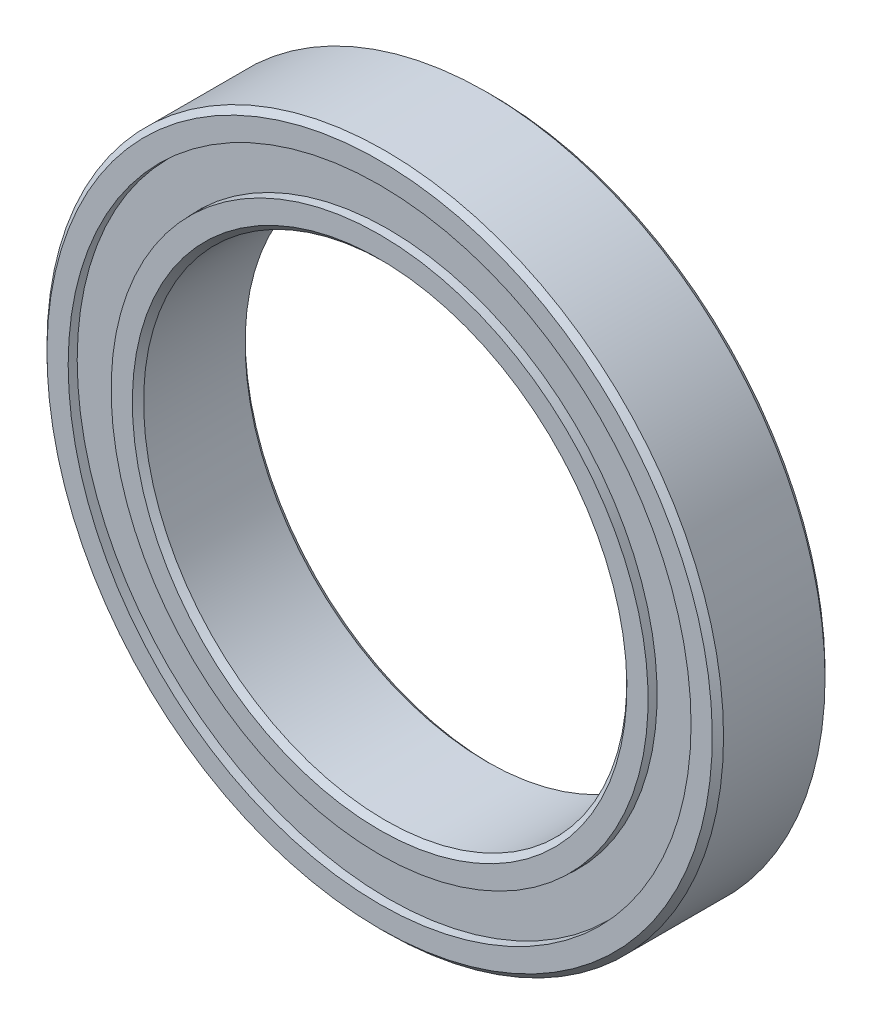
ISO-10303-21;
HEADER;
FILE_DESCRIPTION(('STEP AP214'),'2;1');
FILE_NAME('part.step','',(''),(''),'','','');
FILE_SCHEMA(('AUTOMOTIVE_DESIGN { 1 0 10303 214 1 1 1 1 }'));
ENDSEC;
DATA;
#1=APPLICATION_CONTEXT('core data for automotive mechanical design processes');
#2=APPLICATION_PROTOCOL_DEFINITION('international standard','automotive_design',2000,#1);
#3=PRODUCT_CONTEXT('',#1,'mechanical');
#4=PRODUCT('Part','Part','',(#3));
#5=PRODUCT_RELATED_PRODUCT_CATEGORY('part','',(#4));
#6=PRODUCT_DEFINITION_FORMATION('','',#4);
#7=PRODUCT_DEFINITION_CONTEXT('part definition',#1,'design');
#8=PRODUCT_DEFINITION('design','',#6,#7);
#9=PRODUCT_DEFINITION_SHAPE('','',#8);
#10=(LENGTH_UNIT() NAMED_UNIT(*) SI_UNIT(.MILLI.,.METRE.));
#11=(NAMED_UNIT(*) PLANE_ANGLE_UNIT() SI_UNIT($,.RADIAN.));
#12=(NAMED_UNIT(*) SI_UNIT($,.STERADIAN.) SOLID_ANGLE_UNIT());
#13=UNCERTAINTY_MEASURE_WITH_UNIT(LENGTH_MEASURE(1.E-05),#10,'distance_accuracy_value','');
#14=(GEOMETRIC_REPRESENTATION_CONTEXT(3) GLOBAL_UNCERTAINTY_ASSIGNED_CONTEXT((#13)) GLOBAL_UNIT_ASSIGNED_CONTEXT((#10,
#11,#12)) REPRESENTATION_CONTEXT('',''));
#15=CARTESIAN_POINT('',(0.,0.,0.));
#16=DIRECTION('',(0.,0.,1.));
#17=DIRECTION('',(1.,0.,0.));
#18=AXIS2_PLACEMENT_3D('',#15,#16,#17);
#19=CARTESIAN_POINT('',(6.50234999136853,16.7845001292785,0.));
#20=DIRECTION('',(0.,0.,1.));
#21=DIRECTION('',(0.361241666187141,0.932472229404361,0.));
#22=AXIS2_PLACEMENT_3D('',#19,#20,#21);
#23=SPHERICAL_SURFACE('',#22,2.0487876571762);
#24=CARTESIAN_POINT('',(6.50234999136853,16.7845001292785,2.04878765717619));
#25=VERTEX_POINT('',#24);
#26=VERTEX_LOOP('',#25);
#27=FACE_BOUND('',#26,.T.);
#28=ADVANCED_FACE('F46',(#27),#23,.T.);
#29=CLOSED_SHELL('',(#28));
#30=MANIFOLD_SOLID_BREP('B2',#29);
#31=CARTESIAN_POINT('',(12.1265215856379,13.302160509972,0.));
#32=DIRECTION('',(0.,0.,1.));
#33=DIRECTION('',(0.673695643646548,0.739008917220668,0.));
#34=AXIS2_PLACEMENT_3D('',#31,#32,#33);
#35=SPHERICAL_SURFACE('',#34,2.0487876571762);
#36=CARTESIAN_POINT('',(12.1265215856379,13.302160509972,2.04878765717619));
#37=VERTEX_POINT('',#36);
#38=VERTEX_LOOP('',#37);
#39=FACE_BOUND('',#38,.T.);
#40=ADVANCED_FACE('F69',(#39),#35,.T.);
#41=CLOSED_SHELL('',(#40));
#42=MANIFOLD_SOLID_BREP('B6',#41);
#43=CARTESIAN_POINT('',(16.112939244391,8.02329040397788,0.));
#44=DIRECTION('',(0.,0.,1.));
#45=DIRECTION('',(0.895163291355057,0.445738355776549,0.));
#46=AXIS2_PLACEMENT_3D('',#43,#44,#45);
#47=SPHERICAL_SURFACE('',#46,2.0487876571762);
#48=CARTESIAN_POINT('',(16.112939244391,8.02329040397788,2.04878765717619));
#49=VERTEX_POINT('',#48);
#50=VERTEX_LOOP('',#49);
#51=FACE_BOUND('',#50,.T.);
#52=ADVANCED_FACE('F92',(#51),#47,.T.);
#53=CLOSED_SHELL('',(#52));
#54=MANIFOLD_SOLID_BREP('B42',#53);
#55=CARTESIAN_POINT('',(17.9232151733106,1.66083047033963,0.));
#56=DIRECTION('',(0.,0.,1.));
#57=DIRECTION('',(0.995734176295033,0.092268359463313,0.));
#58=AXIS2_PLACEMENT_3D('',#55,#56,#57);
#59=SPHERICAL_SURFACE('',#58,2.0487876571762);
#60=CARTESIAN_POINT('',(17.9232151733106,1.66083047033963,2.04878765717619));
#61=VERTEX_POINT('',#60);
#62=VERTEX_LOOP('',#61);
#63=FACE_BOUND('',#62,.T.);
#64=ADVANCED_FACE('F115',(#63),#59,.T.);
#65=CLOSED_SHELL('',(#64));
#66=MANIFOLD_SOLID_BREP('B65',#65);
#67=CARTESIAN_POINT('',(17.3128615771108,-4.92593382129731,0.));
#68=DIRECTION('',(0.,0.,1.));
#69=DIRECTION('',(0.961825643172822,-0.273662990072073,0.));
#70=AXIS2_PLACEMENT_3D('',#67,#68,#69);
#71=SPHERICAL_SURFACE('',#70,2.0487876571762);
#72=CARTESIAN_POINT('',(17.3128615771108,-4.92593382129731,2.04878765717619));
#73=VERTEX_POINT('',#72);
#74=VERTEX_LOOP('',#73);
#75=FACE_BOUND('',#74,.T.);
#76=ADVANCED_FACE('F138',(#75),#71,.T.);
#77=CLOSED_SHELL('',(#76));
#78=MANIFOLD_SOLID_BREP('B88',#77);
#79=CARTESIAN_POINT('',(14.3643100910444,-10.8474234548265,0.));
#80=DIRECTION('',(0.,0.,1.));
#81=DIRECTION('',(0.798017227280245,-0.602634636379249,0.));
#82=AXIS2_PLACEMENT_3D('',#79,#80,#81);
#83=SPHERICAL_SURFACE('',#82,2.0487876571762);
#84=CARTESIAN_POINT('',(14.3643100910444,-10.8474234548265,2.04878765717619));
#85=VERTEX_POINT('',#84);
#86=VERTEX_LOOP('',#85);
#87=FACE_BOUND('',#86,.T.);
#88=ADVANCED_FACE('F161',(#87),#83,.T.);
#89=CLOSED_SHELL('',(#88));
#90=MANIFOLD_SOLID_BREP('B111',#89);
#91=CARTESIAN_POINT('',(9.47577893179253,-15.303908443133,0.));
#92=DIRECTION('',(0.,0.,1.));
#93=DIRECTION('',(0.526432162877363,-0.85021713572961,0.));
#94=AXIS2_PLACEMENT_3D('',#91,#92,#93);
#95=SPHERICAL_SURFACE('',#94,2.0487876571762);
#96=CARTESIAN_POINT('',(9.47577893179253,-15.303908443133,2.04878765717619));
#97=VERTEX_POINT('',#96);
#98=VERTEX_LOOP('',#97);
#99=FACE_BOUND('',#98,.T.);
#100=ADVANCED_FACE('F184',(#99),#95,.T.);
#101=CLOSED_SHELL('',(#100));
#102=MANIFOLD_SOLID_BREP('B134',#101);
#103=CARTESIAN_POINT('',(3.3074913206984,-17.6935157943102,0.));
#104=DIRECTION('',(0.,0.,1.));
#105=DIRECTION('',(0.183749517816578,-0.9829730996839,0.));
#106=AXIS2_PLACEMENT_3D('',#103,#104,#105);
#107=SPHERICAL_SURFACE('',#106,2.0487876571762);
#108=CARTESIAN_POINT('',(3.3074913206984,-17.6935157943102,2.04878765717619));
#109=VERTEX_POINT('',#108);
#110=VERTEX_LOOP('',#109);
#111=FACE_BOUND('',#110,.T.);
#112=ADVANCED_FACE('F207',(#111),#107,.T.);
#113=CLOSED_SHELL('',(#112));
#114=MANIFOLD_SOLID_BREP('B157',#113);
#115=CARTESIAN_POINT('',(-3.30749132069815,-17.6935157943103,0.));
#116=DIRECTION('',(0.,0.,1.));
#117=DIRECTION('',(-0.183749517816564,-0.982973099683903,0.));
#118=AXIS2_PLACEMENT_3D('',#115,#116,#117);
#119=SPHERICAL_SURFACE('',#118,2.0487876571762);
#120=CARTESIAN_POINT('',(-3.30749132069815,-17.6935157943103,2.04878765717619));
#121=VERTEX_POINT('',#120);
#122=VERTEX_LOOP('',#121);
#123=FACE_BOUND('',#122,.T.);
#124=ADVANCED_FACE('F230',(#123),#119,.T.);
#125=CLOSED_SHELL('',(#124));
#126=MANIFOLD_SOLID_BREP('B180',#125);
#127=CARTESIAN_POINT('',(-9.47577893179231,-15.3039084431331,0.));
#128=DIRECTION('',(0.,0.,1.));
#129=DIRECTION('',(-0.526432162877351,-0.850217135729617,0.));
#130=AXIS2_PLACEMENT_3D('',#127,#128,#129);
#131=SPHERICAL_SURFACE('',#130,2.0487876571762);
#132=CARTESIAN_POINT('',(-9.47577893179231,-15.3039084431331,2.04878765717619));
#133=VERTEX_POINT('',#132);
#134=VERTEX_LOOP('',#133);
#135=FACE_BOUND('',#134,.T.);
#136=ADVANCED_FACE('F253',(#135),#131,.T.);
#137=CLOSED_SHELL('',(#136));
#138=MANIFOLD_SOLID_BREP('B203',#137);
#139=CARTESIAN_POINT('',(-14.3643100910443,-10.8474234548267,0.));
#140=DIRECTION('',(0.,0.,1.));
#141=DIRECTION('',(-0.798017227280236,-0.602634636379261,0.));
#142=AXIS2_PLACEMENT_3D('',#139,#140,#141);
#143=SPHERICAL_SURFACE('',#142,2.0487876571762);
#144=CARTESIAN_POINT('',(-14.3643100910443,-10.8474234548267,2.04878765717619));
#145=VERTEX_POINT('',#144);
#146=VERTEX_LOOP('',#145);
#147=FACE_BOUND('',#146,.T.);
#148=ADVANCED_FACE('F276',(#147),#143,.T.);
#149=CLOSED_SHELL('',(#148));
#150=MANIFOLD_SOLID_BREP('B226',#149);
#151=CARTESIAN_POINT('',(-17.3128615771107,-4.92593382129756,0.));
#152=DIRECTION('',(0.,0.,1.));
#153=DIRECTION('',(-0.961825643172818,-0.273662990072087,0.));
#154=AXIS2_PLACEMENT_3D('',#151,#152,#153);
#155=SPHERICAL_SURFACE('',#154,2.0487876571762);
#156=CARTESIAN_POINT('',(-17.3128615771107,-4.92593382129756,2.04878765717619));
#157=VERTEX_POINT('',#156);
#158=VERTEX_LOOP('',#157);
#159=FACE_BOUND('',#158,.T.);
#160=ADVANCED_FACE('F299',(#159),#155,.T.);
#161=CLOSED_SHELL('',(#160));
#162=MANIFOLD_SOLID_BREP('B249',#161);
#163=CARTESIAN_POINT('',(-17.9232151733106,1.66083047033938,0.));
#164=DIRECTION('',(0.,0.,1.));
#165=DIRECTION('',(-0.995734176295035,0.0922683594632987,0.));
#166=AXIS2_PLACEMENT_3D('',#163,#164,#165);
#167=SPHERICAL_SURFACE('',#166,2.0487876571762);
#168=CARTESIAN_POINT('',(-17.9232151733106,1.66083047033938,2.04878765717619));
#169=VERTEX_POINT('',#168);
#170=VERTEX_LOOP('',#169);
#171=FACE_BOUND('',#170,.T.);
#172=ADVANCED_FACE('F322',(#171),#167,.T.);
#173=CLOSED_SHELL('',(#172));
#174=MANIFOLD_SOLID_BREP('B272',#173);
#175=CARTESIAN_POINT('',(-16.1129392443911,8.02329040397765,0.));
#176=DIRECTION('',(0.,0.,1.));
#177=DIRECTION('',(-0.895163291355063,0.445738355776536,0.));
#178=AXIS2_PLACEMENT_3D('',#175,#176,#177);
#179=SPHERICAL_SURFACE('',#178,2.0487876571762);
#180=CARTESIAN_POINT('',(-16.1129392443911,8.02329040397765,2.04878765717619));
#181=VERTEX_POINT('',#180);
#182=VERTEX_LOOP('',#181);
#183=FACE_BOUND('',#182,.T.);
#184=ADVANCED_FACE('F345',(#183),#179,.T.);
#185=CLOSED_SHELL('',(#184));
#186=MANIFOLD_SOLID_BREP('B295',#185);
#187=CARTESIAN_POINT('',(-12.1265215856381,13.3021605099718,0.));
#188=DIRECTION('',(0.,0.,1.));
#189=DIRECTION('',(-0.673695643646558,0.739008917220658,0.));
#190=AXIS2_PLACEMENT_3D('',#187,#188,#189);
#191=SPHERICAL_SURFACE('',#190,2.0487876571762);
#192=CARTESIAN_POINT('',(-12.1265215856381,13.3021605099718,2.04878765717619));
#193=VERTEX_POINT('',#192);
#194=VERTEX_LOOP('',#193);
#195=FACE_BOUND('',#194,.T.);
#196=ADVANCED_FACE('F368',(#195),#191,.T.);
#197=CLOSED_SHELL('',(#196));
#198=MANIFOLD_SOLID_BREP('B318',#197);
#199=CARTESIAN_POINT('',(-6.50234999136877,16.7845001292784,0.));
#200=DIRECTION('',(0.,0.,1.));
#201=DIRECTION('',(-0.361241666187154,0.932472229404355,0.));
#202=AXIS2_PLACEMENT_3D('',#199,#200,#201);
#203=SPHERICAL_SURFACE('',#202,2.0487876571762);
#204=CARTESIAN_POINT('',(-6.50234999136877,16.7845001292784,2.04878765717619));
#205=VERTEX_POINT('',#204);
#206=VERTEX_LOOP('',#205);
#207=FACE_BOUND('',#206,.T.);
#208=ADVANCED_FACE('F391',(#207),#203,.T.);
#209=CLOSED_SHELL('',(#208));
#210=MANIFOLD_SOLID_BREP('B341',#209);
#211=CARTESIAN_POINT('',(0.,18.,0.));
#212=DIRECTION('',(0.,0.,1.));
#213=DIRECTION('',(0.,1.,0.));
#214=AXIS2_PLACEMENT_3D('',#211,#212,#213);
#215=SPHERICAL_SURFACE('',#214,2.0487876571762);
#216=CARTESIAN_POINT('',(0.,18.,2.04878765717619));
#217=VERTEX_POINT('',#216);
#218=VERTEX_LOOP('',#217);
#219=FACE_BOUND('',#218,.T.);
#220=ADVANCED_FACE('F416',(#219),#215,.T.);
#221=CLOSED_SHELL('',(#220));
#222=MANIFOLD_SOLID_BREP('B364',#221);
#223=CARTESIAN_POINT('',(0.,16.6666666666667,3.50000000000003));
#224=DIRECTION('',(0.,0.,-1.));
#225=DIRECTION('',(0.,1.,0.));
#226=AXIS2_PLACEMENT_3D('',#223,#224,#225);
#227=PLANE('',#226);
#228=CARTESIAN_POINT('',(0.,0.,3.50000000000002));
#229=DIRECTION('',(0.,0.,1.));
#230=DIRECTION('',(0.,-1.,0.));
#231=AXIS2_PLACEMENT_3D('',#228,#229,#230);
#232=CIRCLE('',#231,15.35);
#233=CARTESIAN_POINT('',(0.,-15.35,3.50000000000002));
#234=VERTEX_POINT('',#233);
#235=EDGE_CURVE('E467',#234,#234,#232,.T.);
#236=ORIENTED_EDGE('',*,*,#235,.F.);
#237=EDGE_LOOP('',(#236));
#238=FACE_BOUND('',#237,.T.);
#239=CARTESIAN_POINT('',(0.,0.,3.50000000000002));
#240=DIRECTION('',(0.,0.,1.));
#241=DIRECTION('',(0.,-1.,0.));
#242=AXIS2_PLACEMENT_3D('',#239,#240,#241);
#243=CIRCLE('',#242,16.6666666666667);
#244=CARTESIAN_POINT('',(0.,-16.6666666666667,3.50000000000002));
#245=VERTEX_POINT('',#244);
#246=EDGE_CURVE('E415',#245,#245,#243,.T.);
#247=ORIENTED_EDGE('',*,*,#246,.T.);
#248=EDGE_LOOP('',(#247));
#249=FACE_BOUND('',#248,.T.);
#250=ADVANCED_FACE('F439',(#238,#249),#227,.F.);
#251=CARTESIAN_POINT('',(0.,0.,3.50000000000002));
#252=DIRECTION('',(0.,0.,1.));
#253=DIRECTION('',(0.,-1.,0.));
#254=AXIS2_PLACEMENT_3D('',#251,#252,#253);
#255=CYLINDRICAL_SURFACE('',#254,16.6666666666667);
#256=ORIENTED_EDGE('',*,*,#246,.F.);
#257=EDGE_LOOP('',(#256));
#258=FACE_BOUND('',#257,.T.);
#259=CARTESIAN_POINT('',(0.,0.,1.55555555555555));
#260=DIRECTION('',(0.,0.,1.));
#261=DIRECTION('',(0.,-1.,0.));
#262=AXIS2_PLACEMENT_3D('',#259,#260,#261);
#263=CIRCLE('',#262,16.6666666666667);
#264=CARTESIAN_POINT('',(0.,-16.6666666666667,1.55555555555555));
#265=VERTEX_POINT('',#264);
#266=EDGE_CURVE('E445',#265,#265,#263,.T.);
#267=ORIENTED_EDGE('',*,*,#266,.T.);
#268=EDGE_LOOP('',(#267));
#269=FACE_BOUND('',#268,.T.);
#270=ADVANCED_FACE('F474',(#258,#269),#255,.T.);
#271=CARTESIAN_POINT('',(0.,0.,0.));
#272=DIRECTION('',(0.,0.,1.));
#273=DIRECTION('',(0.,-1.,0.));
#274=AXIS2_PLACEMENT_3D('',#271,#272,#273);
#275=TOROIDAL_SURFACE('',#274,18.,2.0487876571762);
#276=ORIENTED_EDGE('',*,*,#266,.F.);
#277=EDGE_LOOP('',(#276));
#278=FACE_BOUND('',#277,.T.);
#279=CARTESIAN_POINT('',(0.,0.,-1.55555555555555));
#280=DIRECTION('',(0.,0.,1.));
#281=DIRECTION('',(0.,-1.,0.));
#282=AXIS2_PLACEMENT_3D('',#279,#280,#281);
#283=CIRCLE('',#282,16.6666666666667);
#284=CARTESIAN_POINT('',(0.,-16.6666666666667,-1.55555555555556));
#285=VERTEX_POINT('',#284);
#286=EDGE_CURVE('E449',#285,#285,#283,.T.);
#287=ORIENTED_EDGE('',*,*,#286,.T.);
#288=EDGE_LOOP('',(#287));
#289=FACE_BOUND('',#288,.T.);
#290=ADVANCED_FACE('F478',(#278,#289),#275,.F.);
#291=CARTESIAN_POINT('',(0.,0.,3.50000000000002));
#292=DIRECTION('',(0.,0.,1.));
#293=DIRECTION('',(0.,-1.,0.));
#294=AXIS2_PLACEMENT_3D('',#291,#292,#293);
#295=CYLINDRICAL_SURFACE('',#294,16.6666666666667);
#296=ORIENTED_EDGE('',*,*,#286,.F.);
#297=EDGE_LOOP('',(#296));
#298=FACE_BOUND('',#297,.T.);
#299=CARTESIAN_POINT('',(0.,0.,-3.50000000000003));
#300=DIRECTION('',(0.,0.,1.));
#301=DIRECTION('',(0.,-1.,0.));
#302=AXIS2_PLACEMENT_3D('',#299,#300,#301);
#303=CIRCLE('',#302,16.6666666666667);
#304=CARTESIAN_POINT('',(0.,-16.6666666666667,-3.50000000000003));
#305=VERTEX_POINT('',#304);
#306=EDGE_CURVE('E453',#305,#305,#303,.T.);
#307=ORIENTED_EDGE('',*,*,#306,.T.);
#308=EDGE_LOOP('',(#307));
#309=FACE_BOUND('',#308,.T.);
#310=ADVANCED_FACE('F483',(#298,#309),#295,.T.);
#311=CARTESIAN_POINT('',(0.,15.35,-3.50000000000003));
#312=DIRECTION('',(0.,0.,1.));
#313=DIRECTION('',(0.,-1.,0.));
#314=AXIS2_PLACEMENT_3D('',#311,#312,#313);
#315=PLANE('',#314);
#316=ORIENTED_EDGE('',*,*,#306,.F.);
#317=EDGE_LOOP('',(#316));
#318=FACE_BOUND('',#317,.T.);
#319=CARTESIAN_POINT('',(0.,0.,-3.50000000000003));
#320=DIRECTION('',(0.,0.,1.));
#321=DIRECTION('',(0.,-1.,0.));
#322=AXIS2_PLACEMENT_3D('',#319,#320,#321);
#323=CIRCLE('',#322,15.35);
#324=CARTESIAN_POINT('',(0.,-15.35,-3.50000000000003));
#325=VERTEX_POINT('',#324);
#326=EDGE_CURVE('E458',#325,#325,#323,.T.);
#327=ORIENTED_EDGE('',*,*,#326,.T.);
#328=EDGE_LOOP('',(#327));
#329=FACE_BOUND('',#328,.T.);
#330=ADVANCED_FACE('F489',(#318,#329),#315,.F.);
#331=CARTESIAN_POINT('',(0.,0.,-3.15000000000003));
#332=DIRECTION('',(0.,0.,-1.));
#333=DIRECTION('',(0.,1.,0.));
#334=AXIS2_PLACEMENT_3D('',#331,#332,#333);
#335=CONICAL_SURFACE('',#334,15.,0.785398163397435);
#336=ORIENTED_EDGE('',*,*,#326,.F.);
#337=EDGE_LOOP('',(#336));
#338=FACE_BOUND('',#337,.T.);
#339=CARTESIAN_POINT('',(0.,0.,-3.15000000000003));
#340=DIRECTION('',(0.,0.,1.));
#341=DIRECTION('',(0.,-1.,0.));
#342=AXIS2_PLACEMENT_3D('',#339,#340,#341);
#343=CIRCLE('',#342,15.);
#344=CARTESIAN_POINT('',(0.,-15.,-3.15000000000003));
#345=VERTEX_POINT('',#344);
#346=EDGE_CURVE('E461',#345,#345,#343,.T.);
#347=ORIENTED_EDGE('',*,*,#346,.T.);
#348=EDGE_LOOP('',(#347));
#349=FACE_BOUND('',#348,.T.);
#350=ADVANCED_FACE('F493',(#338,#349),#335,.F.);
#351=CARTESIAN_POINT('',(0.,0.,3.50000000000002));
#352=DIRECTION('',(0.,0.,1.));
#353=DIRECTION('',(0.,-1.,0.));
#354=AXIS2_PLACEMENT_3D('',#351,#352,#353);
#355=CYLINDRICAL_SURFACE('',#354,15.);
#356=ORIENTED_EDGE('',*,*,#346,.F.);
#357=EDGE_LOOP('',(#356));
#358=FACE_BOUND('',#357,.T.);
#359=CARTESIAN_POINT('',(0.,0.,3.15000000000003));
#360=DIRECTION('',(0.,0.,1.));
#361=DIRECTION('',(0.,-1.,0.));
#362=AXIS2_PLACEMENT_3D('',#359,#360,#361);
#363=CIRCLE('',#362,15.);
#364=CARTESIAN_POINT('',(0.,-15.,3.15000000000003));
#365=VERTEX_POINT('',#364);
#366=EDGE_CURVE('E464',#365,#365,#363,.T.);
#367=ORIENTED_EDGE('',*,*,#366,.T.);
#368=EDGE_LOOP('',(#367));
#369=FACE_BOUND('',#368,.T.);
#370=ADVANCED_FACE('F497',(#358,#369),#355,.F.);
#371=CARTESIAN_POINT('',(0.,0.,3.50000000000002));
#372=DIRECTION('',(0.,0.,1.));
#373=DIRECTION('',(0.,-1.,0.));
#374=AXIS2_PLACEMENT_3D('',#371,#372,#373);
#375=CONICAL_SURFACE('',#374,15.35,0.785398163397458);
#376=ORIENTED_EDGE('',*,*,#366,.F.);
#377=EDGE_LOOP('',(#376));
#378=FACE_BOUND('',#377,.T.);
#379=ORIENTED_EDGE('',*,*,#235,.T.);
#380=EDGE_LOOP('',(#379));
#381=FACE_BOUND('',#380,.T.);
#382=ADVANCED_FACE('F471',(#378,#381),#375,.F.);
#383=CLOSED_SHELL('',(#250,#270,#290,#310,#330,#350,#370,#382));
#384=MANIFOLD_SOLID_BREP('B387',#383);
#385=CARTESIAN_POINT('',(0.,16.6920666666667,-2.58389382858811));
#386=DIRECTION('',(0.,0.,-1.));
#387=DIRECTION('',(0.,1.,0.));
#388=AXIS2_PLACEMENT_3D('',#385,#386,#387);
#389=PLANE('',#388);
#390=CARTESIAN_POINT('',(0.,0.,-2.58389382858812));
#391=DIRECTION('',(0.,0.,1.));
#392=DIRECTION('',(0.,-1.,0.));
#393=AXIS2_PLACEMENT_3D('',#390,#391,#392);
#394=CIRCLE('',#393,16.6920666666667);
#395=CARTESIAN_POINT('',(0.,-16.6920666666667,-2.58389382858812));
#396=VERTEX_POINT('',#395);
#397=EDGE_CURVE('E599',#396,#396,#394,.T.);
#398=ORIENTED_EDGE('',*,*,#397,.F.);
#399=EDGE_LOOP('',(#398));
#400=FACE_BOUND('',#399,.T.);
#401=CARTESIAN_POINT('',(0.,0.,-2.58389382858812));
#402=DIRECTION('',(0.,0.,1.));
#403=DIRECTION('',(0.,-1.,0.));
#404=AXIS2_PLACEMENT_3D('',#401,#402,#403);
#405=CIRCLE('',#404,19.3079333333333);
#406=CARTESIAN_POINT('',(0.,-19.3079333333333,-2.58389382858812));
#407=VERTEX_POINT('',#406);
#408=EDGE_CURVE('E438',#407,#407,#405,.T.);
#409=ORIENTED_EDGE('',*,*,#408,.T.);
#410=EDGE_LOOP('',(#409));
#411=FACE_BOUND('',#410,.T.);
#412=ADVANCED_FACE('F585',(#400,#411),#389,.F.);
#413=CARTESIAN_POINT('',(0.,0.,3.50000000000002));
#414=DIRECTION('',(0.,0.,1.));
#415=DIRECTION('',(0.,-1.,0.));
#416=AXIS2_PLACEMENT_3D('',#413,#414,#415);
#417=CYLINDRICAL_SURFACE('',#416,19.3079333333333);
#418=ORIENTED_EDGE('',*,*,#408,.F.);
#419=EDGE_LOOP('',(#418));
#420=FACE_BOUND('',#419,.T.);
#421=CARTESIAN_POINT('',(0.,0.,-2.96489382858812));
#422=DIRECTION('',(0.,0.,1.));
#423=DIRECTION('',(0.,-1.,0.));
#424=AXIS2_PLACEMENT_3D('',#421,#422,#423);
#425=CIRCLE('',#424,19.3079333333333);
#426=CARTESIAN_POINT('',(0.,-19.3079333333333,-2.96489382858812));
#427=VERTEX_POINT('',#426);
#428=EDGE_CURVE('E591',#427,#427,#425,.T.);
#429=ORIENTED_EDGE('',*,*,#428,.T.);
#430=EDGE_LOOP('',(#429));
#431=FACE_BOUND('',#430,.T.);
#432=ADVANCED_FACE('F608',(#420,#431),#417,.T.);
#433=CARTESIAN_POINT('',(0.,16.6920666666667,-2.96489382858811));
#434=DIRECTION('',(0.,0.,1.));
#435=DIRECTION('',(0.,-1.,0.));
#436=AXIS2_PLACEMENT_3D('',#433,#434,#435);
#437=PLANE('',#436);
#438=ORIENTED_EDGE('',*,*,#428,.F.);
#439=EDGE_LOOP('',(#438));
#440=FACE_BOUND('',#439,.T.);
#441=CARTESIAN_POINT('',(0.,0.,-2.96489382858812));
#442=DIRECTION('',(0.,0.,1.));
#443=DIRECTION('',(0.,-1.,0.));
#444=AXIS2_PLACEMENT_3D('',#441,#442,#443);
#445=CIRCLE('',#444,16.6920666666667);
#446=CARTESIAN_POINT('',(0.,-16.6920666666667,-2.96489382858812));
#447=VERTEX_POINT('',#446);
#448=EDGE_CURVE('E595',#447,#447,#445,.T.);
#449=ORIENTED_EDGE('',*,*,#448,.T.);
#450=EDGE_LOOP('',(#449));
#451=FACE_BOUND('',#450,.T.);
#452=ADVANCED_FACE('F612',(#440,#451),#437,.F.);
#453=CARTESIAN_POINT('',(0.,0.,3.50000000000002));
#454=DIRECTION('',(0.,0.,1.));
#455=DIRECTION('',(0.,-1.,0.));
#456=AXIS2_PLACEMENT_3D('',#453,#454,#455);
#457=CYLINDRICAL_SURFACE('',#456,16.6920666666667);
#458=ORIENTED_EDGE('',*,*,#448,.F.);
#459=EDGE_LOOP('',(#458));
#460=FACE_BOUND('',#459,.T.);
#461=ORIENTED_EDGE('',*,*,#397,.T.);
#462=EDGE_LOOP('',(#461));
#463=FACE_BOUND('',#462,.T.);
#464=ADVANCED_FACE('F605',(#460,#463),#457,.F.);
#465=CLOSED_SHELL('',(#412,#432,#452,#464));
#466=MANIFOLD_SOLID_BREP('B410',#465);
#467=CARTESIAN_POINT('',(0.,16.6920666666667,2.9648938285881));
#468=DIRECTION('',(0.,0.,-1.));
#469=DIRECTION('',(0.,1.,0.));
#470=AXIS2_PLACEMENT_3D('',#467,#468,#469);
#471=PLANE('',#470);
#472=CARTESIAN_POINT('',(0.,0.,2.9648938285881));
#473=DIRECTION('',(0.,0.,1.));
#474=DIRECTION('',(0.,-1.,0.));
#475=AXIS2_PLACEMENT_3D('',#472,#473,#474);
#476=CIRCLE('',#475,16.6920666666667);
#477=CARTESIAN_POINT('',(0.,-16.6920666666667,2.9648938285881));
#478=VERTEX_POINT('',#477);
#479=EDGE_CURVE('E584',#478,#478,#476,.T.);
#480=ORIENTED_EDGE('',*,*,#479,.F.);
#481=EDGE_LOOP('',(#480));
#482=FACE_BOUND('',#481,.T.);
#483=CARTESIAN_POINT('',(0.,0.,2.9648938285881));
#484=DIRECTION('',(0.,0.,1.));
#485=DIRECTION('',(0.,-1.,0.));
#486=AXIS2_PLACEMENT_3D('',#483,#484,#485);
#487=CIRCLE('',#486,19.3079333333333);
#488=CARTESIAN_POINT('',(0.,-19.3079333333333,2.9648938285881));
#489=VERTEX_POINT('',#488);
#490=EDGE_CURVE('E676',#489,#489,#487,.T.);
#491=ORIENTED_EDGE('',*,*,#490,.T.);
#492=EDGE_LOOP('',(#491));
#493=FACE_BOUND('',#492,.T.);
#494=ADVANCED_FACE('F662',(#482,#493),#471,.F.);
#495=CARTESIAN_POINT('',(0.,0.,3.50000000000002));
#496=DIRECTION('',(0.,0.,1.));
#497=DIRECTION('',(0.,-1.,0.));
#498=AXIS2_PLACEMENT_3D('',#495,#496,#497);
#499=CYLINDRICAL_SURFACE('',#498,16.6920666666667);
#500=CARTESIAN_POINT('',(0.,0.,2.5838938285881));
#501=DIRECTION('',(0.,0.,1.));
#502=DIRECTION('',(0.,-1.,0.));
#503=AXIS2_PLACEMENT_3D('',#500,#501,#502);
#504=CIRCLE('',#503,16.6920666666667);
#505=CARTESIAN_POINT('',(0.,-16.6920666666667,2.5838938285881));
#506=VERTEX_POINT('',#505);
#507=EDGE_CURVE('E668',#506,#506,#504,.T.);
#508=ORIENTED_EDGE('',*,*,#507,.F.);
#509=EDGE_LOOP('',(#508));
#510=FACE_BOUND('',#509,.T.);
#511=ORIENTED_EDGE('',*,*,#479,.T.);
#512=EDGE_LOOP('',(#511));
#513=FACE_BOUND('',#512,.T.);
#514=ADVANCED_FACE('F691',(#510,#513),#499,.F.);
#515=CARTESIAN_POINT('',(0.,16.6920666666667,2.5838938285881));
#516=DIRECTION('',(0.,0.,1.));
#517=DIRECTION('',(0.,-1.,0.));
#518=AXIS2_PLACEMENT_3D('',#515,#516,#517);
#519=PLANE('',#518);
#520=CARTESIAN_POINT('',(0.,0.,2.5838938285881));
#521=DIRECTION('',(0.,0.,1.));
#522=DIRECTION('',(0.,-1.,0.));
#523=AXIS2_PLACEMENT_3D('',#520,#521,#522);
#524=CIRCLE('',#523,19.3079333333333);
#525=CARTESIAN_POINT('',(0.,-19.3079333333333,2.5838938285881));
#526=VERTEX_POINT('',#525);
#527=EDGE_CURVE('E672',#526,#526,#524,.T.);
#528=ORIENTED_EDGE('',*,*,#527,.F.);
#529=EDGE_LOOP('',(#528));
#530=FACE_BOUND('',#529,.T.);
#531=ORIENTED_EDGE('',*,*,#507,.T.);
#532=EDGE_LOOP('',(#531));
#533=FACE_BOUND('',#532,.T.);
#534=ADVANCED_FACE('F686',(#530,#533),#519,.F.);
#535=CARTESIAN_POINT('',(0.,0.,3.50000000000002));
#536=DIRECTION('',(0.,0.,1.));
#537=DIRECTION('',(0.,-1.,0.));
#538=AXIS2_PLACEMENT_3D('',#535,#536,#537);
#539=CYLINDRICAL_SURFACE('',#538,19.3079333333333);
#540=ORIENTED_EDGE('',*,*,#490,.F.);
#541=EDGE_LOOP('',(#540));
#542=FACE_BOUND('',#541,.T.);
#543=ORIENTED_EDGE('',*,*,#527,.T.);
#544=EDGE_LOOP('',(#543));
#545=FACE_BOUND('',#544,.T.);
#546=ADVANCED_FACE('F683',(#542,#545),#539,.T.);
#547=CLOSED_SHELL('',(#494,#514,#534,#546));
#548=MANIFOLD_SOLID_BREP('B433',#547);
#549=CARTESIAN_POINT('',(0.,0.,3.15000000000001));
#550=DIRECTION('',(0.,0.,-1.));
#551=DIRECTION('',(0.,1.,0.));
#552=AXIS2_PLACEMENT_3D('',#549,#550,#551);
#553=CONICAL_SURFACE('',#552,21.,0.785398163397447);
#554=CARTESIAN_POINT('',(0.,0.,3.50000000000001));
#555=DIRECTION('',(0.,0.,1.));
#556=DIRECTION('',(0.,-1.,0.));
#557=AXIS2_PLACEMENT_3D('',#554,#555,#556);
#558=CIRCLE('',#557,20.65);
#559=CARTESIAN_POINT('',(0.,-20.65,3.50000000000001));
#560=VERTEX_POINT('',#559);
#561=EDGE_CURVE('E760',#560,#560,#558,.T.);
#562=ORIENTED_EDGE('',*,*,#561,.F.);
#563=EDGE_LOOP('',(#562));
#564=FACE_BOUND('',#563,.T.);
#565=CARTESIAN_POINT('',(0.,0.,3.15000000000001));
#566=DIRECTION('',(0.,0.,1.));
#567=DIRECTION('',(0.,-1.,0.));
#568=AXIS2_PLACEMENT_3D('',#565,#566,#567);
#569=CIRCLE('',#568,21.);
#570=CARTESIAN_POINT('',(0.,-21.,3.15000000000001));
#571=VERTEX_POINT('',#570);
#572=EDGE_CURVE('E661',#571,#571,#569,.T.);
#573=ORIENTED_EDGE('',*,*,#572,.T.);
#574=EDGE_LOOP('',(#573));
#575=FACE_BOUND('',#574,.T.);
#576=ADVANCED_FACE('F732',(#564,#575),#553,.T.);
#577=CARTESIAN_POINT('',(0.,0.,3.50000000000002));
#578=DIRECTION('',(0.,0.,1.));
#579=DIRECTION('',(0.,-1.,0.));
#580=AXIS2_PLACEMENT_3D('',#577,#578,#579);
#581=CYLINDRICAL_SURFACE('',#580,21.);
#582=ORIENTED_EDGE('',*,*,#572,.F.);
#583=EDGE_LOOP('',(#582));
#584=FACE_BOUND('',#583,.T.);
#585=CARTESIAN_POINT('',(0.,0.,-3.15000000000003));
#586=DIRECTION('',(0.,0.,1.));
#587=DIRECTION('',(0.,-1.,0.));
#588=AXIS2_PLACEMENT_3D('',#585,#586,#587);
#589=CIRCLE('',#588,21.);
#590=CARTESIAN_POINT('',(0.,-21.,-3.15000000000003));
#591=VERTEX_POINT('',#590);
#592=EDGE_CURVE('E738',#591,#591,#589,.T.);
#593=ORIENTED_EDGE('',*,*,#592,.T.);
#594=EDGE_LOOP('',(#593));
#595=FACE_BOUND('',#594,.T.);
#596=ADVANCED_FACE('F767',(#584,#595),#581,.T.);
#597=CARTESIAN_POINT('',(0.,0.,-3.50000000000003));
#598=DIRECTION('',(0.,0.,1.));
#599=DIRECTION('',(0.,-1.,0.));
#600=AXIS2_PLACEMENT_3D('',#597,#598,#599);
#601=CONICAL_SURFACE('',#600,20.65,0.785398163397447);
#602=ORIENTED_EDGE('',*,*,#592,.F.);
#603=EDGE_LOOP('',(#602));
#604=FACE_BOUND('',#603,.T.);
#605=CARTESIAN_POINT('',(0.,0.,-3.50000000000003));
#606=DIRECTION('',(0.,0.,1.));
#607=DIRECTION('',(0.,-1.,0.));
#608=AXIS2_PLACEMENT_3D('',#605,#606,#607);
#609=CIRCLE('',#608,20.65);
#610=CARTESIAN_POINT('',(0.,-20.65,-3.50000000000003));
#611=VERTEX_POINT('',#610);
#612=EDGE_CURVE('E742',#611,#611,#609,.T.);
#613=ORIENTED_EDGE('',*,*,#612,.T.);
#614=EDGE_LOOP('',(#613));
#615=FACE_BOUND('',#614,.T.);
#616=ADVANCED_FACE('F771',(#604,#615),#601,.T.);
#617=CARTESIAN_POINT('',(0.,20.65,-3.50000000000002));
#618=DIRECTION('',(0.,0.,1.));
#619=DIRECTION('',(0.,-1.,0.));
#620=AXIS2_PLACEMENT_3D('',#617,#618,#619);
#621=PLANE('',#620);
#622=ORIENTED_EDGE('',*,*,#612,.F.);
#623=EDGE_LOOP('',(#622));
#624=FACE_BOUND('',#623,.T.);
#625=CARTESIAN_POINT('',(0.,0.,-3.50000000000002));
#626=DIRECTION('',(0.,0.,1.));
#627=DIRECTION('',(0.,-1.,0.));
#628=AXIS2_PLACEMENT_3D('',#625,#626,#627);
#629=CIRCLE('',#628,19.3333333333333);
#630=CARTESIAN_POINT('',(0.,-19.3333333333333,-3.50000000000003));
#631=VERTEX_POINT('',#630);
#632=EDGE_CURVE('E746',#631,#631,#629,.T.);
#633=ORIENTED_EDGE('',*,*,#632,.T.);
#634=EDGE_LOOP('',(#633));
#635=FACE_BOUND('',#634,.T.);
#636=ADVANCED_FACE('F776',(#624,#635),#621,.F.);
#637=CARTESIAN_POINT('',(0.,0.,3.50000000000002));
#638=DIRECTION('',(0.,0.,1.));
#639=DIRECTION('',(0.,-1.,0.));
#640=AXIS2_PLACEMENT_3D('',#637,#638,#639);
#641=CYLINDRICAL_SURFACE('',#640,19.3333333333333);
#642=ORIENTED_EDGE('',*,*,#632,.F.);
#643=EDGE_LOOP('',(#642));
#644=FACE_BOUND('',#643,.T.);
#645=CARTESIAN_POINT('',(0.,0.,-1.55555555555556));
#646=DIRECTION('',(0.,0.,1.));
#647=DIRECTION('',(0.,-1.,0.));
#648=AXIS2_PLACEMENT_3D('',#645,#646,#647);
#649=CIRCLE('',#648,19.3333333333333);
#650=CARTESIAN_POINT('',(0.,-19.3333333333333,-1.55555555555556));
#651=VERTEX_POINT('',#650);
#652=EDGE_CURVE('E751',#651,#651,#649,.T.);
#653=ORIENTED_EDGE('',*,*,#652,.T.);
#654=EDGE_LOOP('',(#653));
#655=FACE_BOUND('',#654,.T.);
#656=ADVANCED_FACE('F782',(#644,#655),#641,.F.);
#657=CARTESIAN_POINT('',(0.,0.,0.));
#658=DIRECTION('',(0.,0.,1.));
#659=DIRECTION('',(0.,-1.,0.));
#660=AXIS2_PLACEMENT_3D('',#657,#658,#659);
#661=TOROIDAL_SURFACE('',#660,18.,2.0487876571762);
#662=ORIENTED_EDGE('',*,*,#652,.F.);
#663=EDGE_LOOP('',(#662));
#664=FACE_BOUND('',#663,.T.);
#665=CARTESIAN_POINT('',(0.,0.,1.55555555555555));
#666=DIRECTION('',(0.,0.,1.));
#667=DIRECTION('',(0.,-1.,0.));
#668=AXIS2_PLACEMENT_3D('',#665,#666,#667);
#669=CIRCLE('',#668,19.3333333333333);
#670=CARTESIAN_POINT('',(0.,-19.3333333333333,1.55555555555555));
#671=VERTEX_POINT('',#670);
#672=EDGE_CURVE('E754',#671,#671,#669,.T.);
#673=ORIENTED_EDGE('',*,*,#672,.T.);
#674=EDGE_LOOP('',(#673));
#675=FACE_BOUND('',#674,.T.);
#676=ADVANCED_FACE('F786',(#664,#675),#661,.F.);
#677=CARTESIAN_POINT('',(0.,0.,3.50000000000002));
#678=DIRECTION('',(0.,0.,1.));
#679=DIRECTION('',(0.,-1.,0.));
#680=AXIS2_PLACEMENT_3D('',#677,#678,#679);
#681=CYLINDRICAL_SURFACE('',#680,19.3333333333333);
#682=ORIENTED_EDGE('',*,*,#672,.F.);
#683=EDGE_LOOP('',(#682));
#684=FACE_BOUND('',#683,.T.);
#685=CARTESIAN_POINT('',(0.,0.,3.50000000000001));
#686=DIRECTION('',(0.,0.,1.));
#687=DIRECTION('',(0.,-1.,0.));
#688=AXIS2_PLACEMENT_3D('',#685,#686,#687);
#689=CIRCLE('',#688,19.3333333333333);
#690=CARTESIAN_POINT('',(0.,-19.3333333333333,3.50000000000001));
#691=VERTEX_POINT('',#690);
#692=EDGE_CURVE('E757',#691,#691,#689,.T.);
#693=ORIENTED_EDGE('',*,*,#692,.T.);
#694=EDGE_LOOP('',(#693));
#695=FACE_BOUND('',#694,.T.);
#696=ADVANCED_FACE('F790',(#684,#695),#681,.F.);
#697=CARTESIAN_POINT('',(0.,20.65,3.50000000000002));
#698=DIRECTION('',(0.,0.,-1.));
#699=DIRECTION('',(0.,1.,0.));
#700=AXIS2_PLACEMENT_3D('',#697,#698,#699);
#701=PLANE('',#700);
#702=ORIENTED_EDGE('',*,*,#692,.F.);
#703=EDGE_LOOP('',(#702));
#704=FACE_BOUND('',#703,.T.);
#705=ORIENTED_EDGE('',*,*,#561,.T.);
#706=EDGE_LOOP('',(#705));
#707=FACE_BOUND('',#706,.T.);
#708=ADVANCED_FACE('F764',(#704,#707),#701,.F.);
#709=CLOSED_SHELL('',(#576,#596,#616,#636,#656,#676,#696,#708));
#710=MANIFOLD_SOLID_BREP('B579',#709);
#711=ADVANCED_BREP_SHAPE_REPRESENTATION('',(#18,#30,#42,#54,#66,#78,#90,#102,#114,#126,#138,
#150,#162,#174,#186,#198,#210,#222,#384,#466,#548,#710),#14);
#712=SHAPE_DEFINITION_REPRESENTATION(#9,#711);
ENDSEC;
END-ISO-10303-21;
